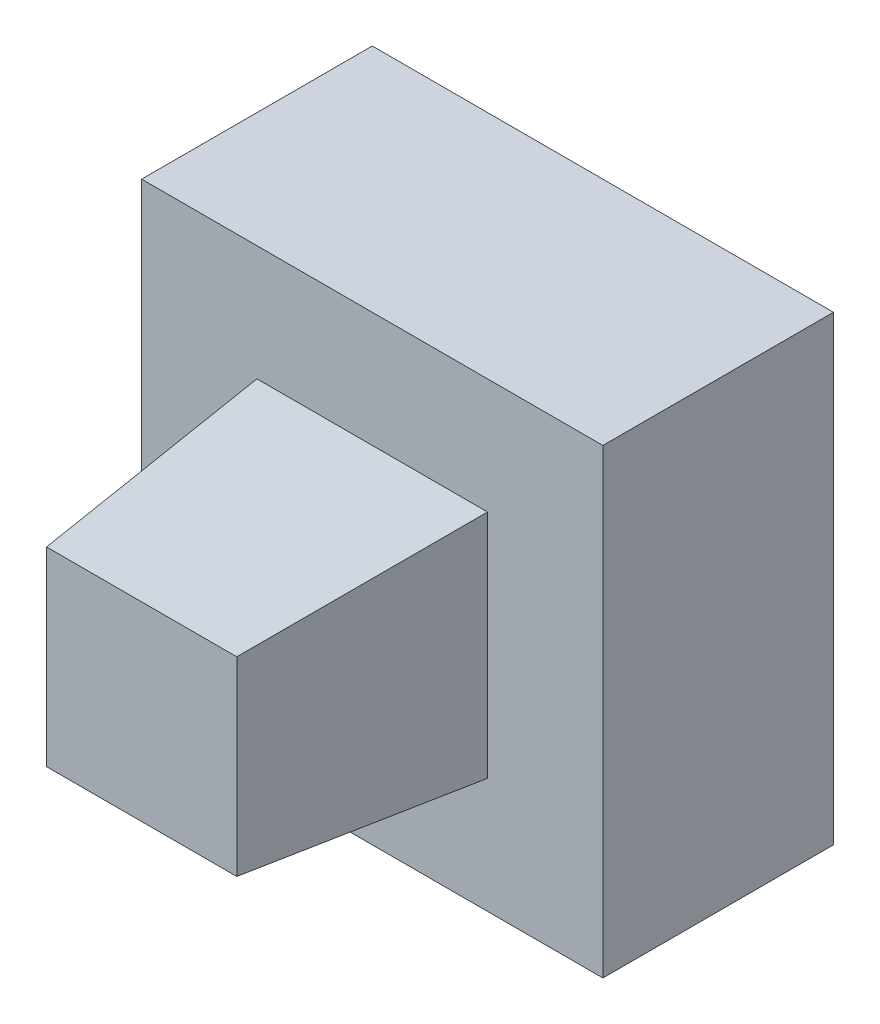
ISO-10303-21;
HEADER;
FILE_DESCRIPTION(('STEP AP214'),'2;1');
FILE_NAME('part.step','',(''),(''),'','','');
FILE_SCHEMA(('AUTOMOTIVE_DESIGN { 1 0 10303 214 1 1 1 1 }'));
ENDSEC;
DATA;
#1=APPLICATION_CONTEXT('core data for automotive mechanical design processes');
#2=APPLICATION_PROTOCOL_DEFINITION('international standard','automotive_design',2000,#1);
#3=PRODUCT_CONTEXT('',#1,'mechanical');
#4=PRODUCT('Part','Part','',(#3));
#5=PRODUCT_RELATED_PRODUCT_CATEGORY('part','',(#4));
#6=PRODUCT_DEFINITION_FORMATION('','',#4);
#7=PRODUCT_DEFINITION_CONTEXT('part definition',#1,'design');
#8=PRODUCT_DEFINITION('design','',#6,#7);
#9=PRODUCT_DEFINITION_SHAPE('','',#8);
#10=(LENGTH_UNIT() NAMED_UNIT(*) SI_UNIT(.MILLI.,.METRE.));
#11=(NAMED_UNIT(*) PLANE_ANGLE_UNIT() SI_UNIT($,.RADIAN.));
#12=(NAMED_UNIT(*) SI_UNIT($,.STERADIAN.) SOLID_ANGLE_UNIT());
#13=UNCERTAINTY_MEASURE_WITH_UNIT(LENGTH_MEASURE(1.E-05),#10,'distance_accuracy_value','');
#14=(GEOMETRIC_REPRESENTATION_CONTEXT(3) GLOBAL_UNCERTAINTY_ASSIGNED_CONTEXT((#13)) GLOBAL_UNIT_ASSIGNED_CONTEXT((#10,
#11,#12)) REPRESENTATION_CONTEXT('',''));
#15=CARTESIAN_POINT('',(0.,0.,0.));
#16=DIRECTION('',(0.,0.,1.));
#17=DIRECTION('',(1.,0.,0.));
#18=AXIS2_PLACEMENT_3D('',#15,#16,#17);
#19=CARTESIAN_POINT('',(0.,0.,10.));
#20=DIRECTION('',(0.,0.,-1.));
#21=DIRECTION('',(-1.,0.,0.));
#22=AXIS2_PLACEMENT_3D('',#19,#20,#21);
#23=PLANE('',#22);
#24=DIRECTION('',(0.,-1.,0.));
#25=VECTOR('',#24,1.);
#26=CARTESIAN_POINT('',(0.,0.,10.));
#27=LINE('',#26,#25);
#28=CARTESIAN_POINT('',(0.,20.,10.));
#29=VERTEX_POINT('',#28);
#30=CARTESIAN_POINT('',(0.,0.,10.));
#31=VERTEX_POINT('',#30);
#32=EDGE_CURVE('E139',#29,#31,#27,.T.);
#33=ORIENTED_EDGE('',*,*,#32,.T.);
#34=DIRECTION('',(1.,0.,0.));
#35=VECTOR('',#34,1.);
#36=CARTESIAN_POINT('',(0.,0.,10.));
#37=LINE('',#36,#35);
#38=CARTESIAN_POINT('',(20.,0.,10.));
#39=VERTEX_POINT('',#38);
#40=EDGE_CURVE('E143',#31,#39,#37,.T.);
#41=ORIENTED_EDGE('',*,*,#40,.T.);
#42=DIRECTION('',(0.,1.,0.));
#43=VECTOR('',#42,1.);
#44=CARTESIAN_POINT('',(20.,0.,10.));
#45=LINE('',#44,#43);
#46=CARTESIAN_POINT('',(20.,20.,10.));
#47=VERTEX_POINT('',#46);
#48=EDGE_CURVE('E145',#39,#47,#45,.T.);
#49=ORIENTED_EDGE('',*,*,#48,.T.);
#50=DIRECTION('',(-1.,0.,0.));
#51=VECTOR('',#50,1.);
#52=CARTESIAN_POINT('',(0.,20.,10.));
#53=LINE('',#52,#51);
#54=EDGE_CURVE('E148',#47,#29,#53,.T.);
#55=ORIENTED_EDGE('',*,*,#54,.T.);
#56=EDGE_LOOP('',(#33,#41,#49,#55));
#57=FACE_BOUND('',#56,.T.);
#58=DIRECTION('',(0.,-1.,0.));
#59=VECTOR('',#58,1.);
#60=CARTESIAN_POINT('',(5.,5.,10.));
#61=LINE('',#60,#59);
#62=CARTESIAN_POINT('',(5.,15.,10.));
#63=VERTEX_POINT('',#62);
#64=CARTESIAN_POINT('',(5.,5.,10.));
#65=VERTEX_POINT('',#64);
#66=EDGE_CURVE('E59',#63,#65,#61,.T.);
#67=ORIENTED_EDGE('',*,*,#66,.F.);
#68=DIRECTION('',(-1.,0.,0.));
#69=VECTOR('',#68,1.);
#70=CARTESIAN_POINT('',(5.,15.,10.));
#71=LINE('',#70,#69);
#72=CARTESIAN_POINT('',(15.,15.,10.));
#73=VERTEX_POINT('',#72);
#74=EDGE_CURVE('E64',#73,#63,#71,.T.);
#75=ORIENTED_EDGE('',*,*,#74,.F.);
#76=DIRECTION('',(0.,1.,0.));
#77=VECTOR('',#76,1.);
#78=CARTESIAN_POINT('',(15.,5.,10.));
#79=LINE('',#78,#77);
#80=CARTESIAN_POINT('',(15.,5.,10.));
#81=VERTEX_POINT('',#80);
#82=EDGE_CURVE('E103',#81,#73,#79,.T.);
#83=ORIENTED_EDGE('',*,*,#82,.F.);
#84=DIRECTION('',(1.,0.,0.));
#85=VECTOR('',#84,1.);
#86=CARTESIAN_POINT('',(5.,5.,10.));
#87=LINE('',#86,#85);
#88=EDGE_CURVE('E104',#65,#81,#87,.T.);
#89=ORIENTED_EDGE('',*,*,#88,.F.);
#90=EDGE_LOOP('',(#67,#75,#83,#89));
#91=FACE_BOUND('',#90,.T.);
#92=ADVANCED_FACE('F43',(#57,#91),#23,.F.);
#93=CARTESIAN_POINT('',(0.,0.,10.));
#94=DIRECTION('',(1.,0.,0.));
#95=DIRECTION('',(0.,0.,-1.));
#96=AXIS2_PLACEMENT_3D('',#93,#94,#95);
#97=PLANE('',#96);
#98=DIRECTION('',(0.,-1.,0.));
#99=VECTOR('',#98,1.);
#100=CARTESIAN_POINT('',(0.,0.,0.));
#101=LINE('',#100,#99);
#102=CARTESIAN_POINT('',(0.,20.,0.));
#103=VERTEX_POINT('',#102);
#104=CARTESIAN_POINT('',(0.,0.,0.));
#105=VERTEX_POINT('',#104);
#106=EDGE_CURVE('E123',#103,#105,#101,.T.);
#107=ORIENTED_EDGE('',*,*,#106,.T.);
#108=DIRECTION('',(0.,0.,-1.));
#109=VECTOR('',#108,1.);
#110=CARTESIAN_POINT('',(0.,0.,10.));
#111=LINE('',#110,#109);
#112=EDGE_CURVE('E11',#31,#105,#111,.T.);
#113=ORIENTED_EDGE('',*,*,#112,.F.);
#114=ORIENTED_EDGE('',*,*,#32,.F.);
#115=DIRECTION('',(0.,0.,-1.));
#116=VECTOR('',#115,1.);
#117=CARTESIAN_POINT('',(0.,20.,10.));
#118=LINE('',#117,#116);
#119=EDGE_CURVE('E146',#29,#103,#118,.T.);
#120=ORIENTED_EDGE('',*,*,#119,.T.);
#121=EDGE_LOOP('',(#107,#113,#114,#120));
#122=FACE_BOUND('',#121,.T.);
#123=ADVANCED_FACE('F44',(#122),#97,.F.);
#124=CARTESIAN_POINT('',(0.,0.,10.));
#125=DIRECTION('',(0.,1.,0.));
#126=DIRECTION('',(0.,0.,1.));
#127=AXIS2_PLACEMENT_3D('',#124,#125,#126);
#128=PLANE('',#127);
#129=DIRECTION('',(1.,0.,0.));
#130=VECTOR('',#129,1.);
#131=CARTESIAN_POINT('',(0.,0.,0.));
#132=LINE('',#131,#130);
#133=CARTESIAN_POINT('',(20.,0.,0.));
#134=VERTEX_POINT('',#133);
#135=EDGE_CURVE('E151',#105,#134,#132,.T.);
#136=ORIENTED_EDGE('',*,*,#135,.T.);
#137=DIRECTION('',(0.,0.,-1.));
#138=VECTOR('',#137,1.);
#139=CARTESIAN_POINT('',(20.,0.,10.));
#140=LINE('',#139,#138);
#141=EDGE_CURVE('E51',#39,#134,#140,.T.);
#142=ORIENTED_EDGE('',*,*,#141,.F.);
#143=ORIENTED_EDGE('',*,*,#40,.F.);
#144=ORIENTED_EDGE('',*,*,#112,.T.);
#145=EDGE_LOOP('',(#136,#142,#143,#144));
#146=FACE_BOUND('',#145,.T.);
#147=ADVANCED_FACE('F180',(#146),#128,.F.);
#148=CARTESIAN_POINT('',(20.,0.,10.));
#149=DIRECTION('',(-1.,0.,0.));
#150=DIRECTION('',(0.,0.,1.));
#151=AXIS2_PLACEMENT_3D('',#148,#149,#150);
#152=PLANE('',#151);
#153=DIRECTION('',(0.,1.,0.));
#154=VECTOR('',#153,1.);
#155=CARTESIAN_POINT('',(20.,0.,0.));
#156=LINE('',#155,#154);
#157=CARTESIAN_POINT('',(20.,20.,0.));
#158=VERTEX_POINT('',#157);
#159=EDGE_CURVE('E153',#134,#158,#156,.T.);
#160=ORIENTED_EDGE('',*,*,#159,.T.);
#161=DIRECTION('',(0.,0.,-1.));
#162=VECTOR('',#161,1.);
#163=CARTESIAN_POINT('',(20.,20.,10.));
#164=LINE('',#163,#162);
#165=EDGE_CURVE('E158',#47,#158,#164,.T.);
#166=ORIENTED_EDGE('',*,*,#165,.F.);
#167=ORIENTED_EDGE('',*,*,#48,.F.);
#168=ORIENTED_EDGE('',*,*,#141,.T.);
#169=EDGE_LOOP('',(#160,#166,#167,#168));
#170=FACE_BOUND('',#169,.T.);
#171=ADVANCED_FACE('F164',(#170),#152,.F.);
#172=CARTESIAN_POINT('',(0.,20.,10.));
#173=DIRECTION('',(0.,-1.,0.));
#174=DIRECTION('',(0.,0.,-1.));
#175=AXIS2_PLACEMENT_3D('',#172,#173,#174);
#176=PLANE('',#175);
#177=DIRECTION('',(-1.,0.,0.));
#178=VECTOR('',#177,1.);
#179=CARTESIAN_POINT('',(0.,20.,0.));
#180=LINE('',#179,#178);
#181=EDGE_CURVE('E142',#158,#103,#180,.T.);
#182=ORIENTED_EDGE('',*,*,#181,.T.);
#183=ORIENTED_EDGE('',*,*,#119,.F.);
#184=ORIENTED_EDGE('',*,*,#54,.F.);
#185=ORIENTED_EDGE('',*,*,#165,.T.);
#186=EDGE_LOOP('',(#182,#183,#184,#185));
#187=FACE_BOUND('',#186,.T.);
#188=ADVANCED_FACE('F175',(#187),#176,.F.);
#189=CARTESIAN_POINT('',(0.,0.,0.));
#190=DIRECTION('',(0.,0.,-1.));
#191=DIRECTION('',(-1.,0.,0.));
#192=AXIS2_PLACEMENT_3D('',#189,#190,#191);
#193=PLANE('',#192);
#194=ORIENTED_EDGE('',*,*,#106,.F.);
#195=ORIENTED_EDGE('',*,*,#181,.F.);
#196=ORIENTED_EDGE('',*,*,#159,.F.);
#197=ORIENTED_EDGE('',*,*,#135,.F.);
#198=EDGE_LOOP('',(#194,#195,#196,#197));
#199=FACE_BOUND('',#198,.T.);
#200=ADVANCED_FACE('F173',(#199),#193,.T.);
#201=CARTESIAN_POINT('',(5.,5.,10.));
#202=DIRECTION('',(-0.996194698091746,0.,0.0871557427476582));
#203=DIRECTION('',(0.0871557427476582,0.,0.996194698091746));
#204=AXIS2_PLACEMENT_3D('',#201,#202,#203);
#205=PLANE('',#204);
#206=ORIENTED_EDGE('',*,*,#66,.T.);
#207=DIRECTION('',(-0.0868265938642476,-0.0868265938642476,-0.992432509138967));
#208=VECTOR('',#207,1.);
#209=CARTESIAN_POINT('',(5.,5.,10.));
#210=LINE('',#209,#208);
#211=CARTESIAN_POINT('',(5.87488663525924,5.87488663525924,20.));
#212=VERTEX_POINT('',#211);
#213=EDGE_CURVE('E117',#212,#65,#210,.T.);
#214=ORIENTED_EDGE('',*,*,#213,.F.);
#215=DIRECTION('',(0.,1.,0.));
#216=VECTOR('',#215,1.);
#217=CARTESIAN_POINT('',(5.87488663525924,0.,20.));
#218=LINE('',#217,#216);
#219=CARTESIAN_POINT('',(5.87488663525924,14.1251133647408,20.));
#220=VERTEX_POINT('',#219);
#221=EDGE_CURVE('E128',#220,#212,#218,.F.);
#222=ORIENTED_EDGE('',*,*,#221,.F.);
#223=DIRECTION('',(-0.0868265938642476,0.0868265938642476,-0.992432509138967));
#224=VECTOR('',#223,1.);
#225=CARTESIAN_POINT('',(5.07538857402067,14.9246114259793,10.8616953440869));
#226=LINE('',#225,#224);
#227=EDGE_CURVE('E127',#220,#63,#226,.T.);
#228=ORIENTED_EDGE('',*,*,#227,.T.);
#229=EDGE_LOOP('',(#206,#214,#222,#228));
#230=FACE_BOUND('',#229,.T.);
#231=ADVANCED_FACE('F197',(#230),#205,.T.);
#232=CARTESIAN_POINT('',(5.,5.,10.));
#233=DIRECTION('',(0.,-0.996194698091746,0.0871557427476582));
#234=DIRECTION('',(0.,0.0871557427476582,0.996194698091746));
#235=AXIS2_PLACEMENT_3D('',#232,#233,#234);
#236=PLANE('',#235);
#237=ORIENTED_EDGE('',*,*,#88,.T.);
#238=DIRECTION('',(0.0868265938642476,-0.0868265938642476,-0.992432509138967));
#239=VECTOR('',#238,1.);
#240=CARTESIAN_POINT('',(15.,5.,10.));
#241=LINE('',#240,#239);
#242=CARTESIAN_POINT('',(14.1251133647408,5.87488663525924,20.));
#243=VERTEX_POINT('',#242);
#244=EDGE_CURVE('E113',#243,#81,#241,.T.);
#245=ORIENTED_EDGE('',*,*,#244,.F.);
#246=DIRECTION('',(-1.,0.,0.));
#247=VECTOR('',#246,1.);
#248=CARTESIAN_POINT('',(0.,5.87488663525924,20.));
#249=LINE('',#248,#247);
#250=EDGE_CURVE('E132',#212,#243,#249,.F.);
#251=ORIENTED_EDGE('',*,*,#250,.F.);
#252=ORIENTED_EDGE('',*,*,#213,.T.);
#253=EDGE_LOOP('',(#237,#245,#251,#252));
#254=FACE_BOUND('',#253,.T.);
#255=ADVANCED_FACE('F111',(#254),#236,.T.);
#256=CARTESIAN_POINT('',(15.,5.,10.));
#257=DIRECTION('',(0.996194698091746,0.,0.0871557427476582));
#258=DIRECTION('',(-0.0871557427476582,0.,0.996194698091746));
#259=AXIS2_PLACEMENT_3D('',#256,#257,#258);
#260=PLANE('',#259);
#261=ORIENTED_EDGE('',*,*,#82,.T.);
#262=DIRECTION('',(0.0868265938642476,0.0868265938642476,-0.992432509138967));
#263=VECTOR('',#262,1.);
#264=CARTESIAN_POINT('',(14.9246114259793,14.9246114259793,10.8616953440869));
#265=LINE('',#264,#263);
#266=CARTESIAN_POINT('',(14.1251133647408,14.1251133647408,20.));
#267=VERTEX_POINT('',#266);
#268=EDGE_CURVE('E122',#267,#73,#265,.T.);
#269=ORIENTED_EDGE('',*,*,#268,.F.);
#270=DIRECTION('',(0.,-1.,0.));
#271=VECTOR('',#270,1.);
#272=CARTESIAN_POINT('',(14.1251133647408,0.,20.));
#273=LINE('',#272,#271);
#274=EDGE_CURVE('E121',#243,#267,#273,.F.);
#275=ORIENTED_EDGE('',*,*,#274,.F.);
#276=ORIENTED_EDGE('',*,*,#244,.T.);
#277=EDGE_LOOP('',(#261,#269,#275,#276));
#278=FACE_BOUND('',#277,.T.);
#279=ADVANCED_FACE('F116',(#278),#260,.T.);
#280=CARTESIAN_POINT('',(5.,15.,10.));
#281=DIRECTION('',(0.,0.996194698091746,0.0871557427476582));
#282=DIRECTION('',(0.,-0.0871557427476582,0.996194698091746));
#283=AXIS2_PLACEMENT_3D('',#280,#281,#282);
#284=PLANE('',#283);
#285=ORIENTED_EDGE('',*,*,#74,.T.);
#286=ORIENTED_EDGE('',*,*,#227,.F.);
#287=DIRECTION('',(1.,0.,0.));
#288=VECTOR('',#287,1.);
#289=CARTESIAN_POINT('',(0.,14.1251133647408,20.));
#290=LINE('',#289,#288);
#291=EDGE_CURVE('E136',#267,#220,#290,.F.);
#292=ORIENTED_EDGE('',*,*,#291,.F.);
#293=ORIENTED_EDGE('',*,*,#268,.T.);
#294=EDGE_LOOP('',(#285,#286,#292,#293));
#295=FACE_BOUND('',#294,.T.);
#296=ADVANCED_FACE('F240',(#295),#284,.T.);
#297=CARTESIAN_POINT('',(0.,0.,20.));
#298=DIRECTION('',(0.,0.,-1.));
#299=DIRECTION('',(-1.,0.,0.));
#300=AXIS2_PLACEMENT_3D('',#297,#298,#299);
#301=PLANE('',#300);
#302=ORIENTED_EDGE('',*,*,#221,.T.);
#303=ORIENTED_EDGE('',*,*,#250,.T.);
#304=ORIENTED_EDGE('',*,*,#274,.T.);
#305=ORIENTED_EDGE('',*,*,#291,.T.);
#306=EDGE_LOOP('',(#302,#303,#304,#305));
#307=FACE_BOUND('',#306,.T.);
#308=ADVANCED_FACE('F241',(#307),#301,.F.);
#309=CLOSED_SHELL('',(#92,#123,#147,#171,#188,#200,#231,#255,#279,#296,#308));
#310=MANIFOLD_SOLID_BREP('B2',#309);
#311=ADVANCED_BREP_SHAPE_REPRESENTATION('',(#18,#310),#14);
#312=SHAPE_DEFINITION_REPRESENTATION(#9,#311);
ENDSEC;
END-ISO-10303-21;
